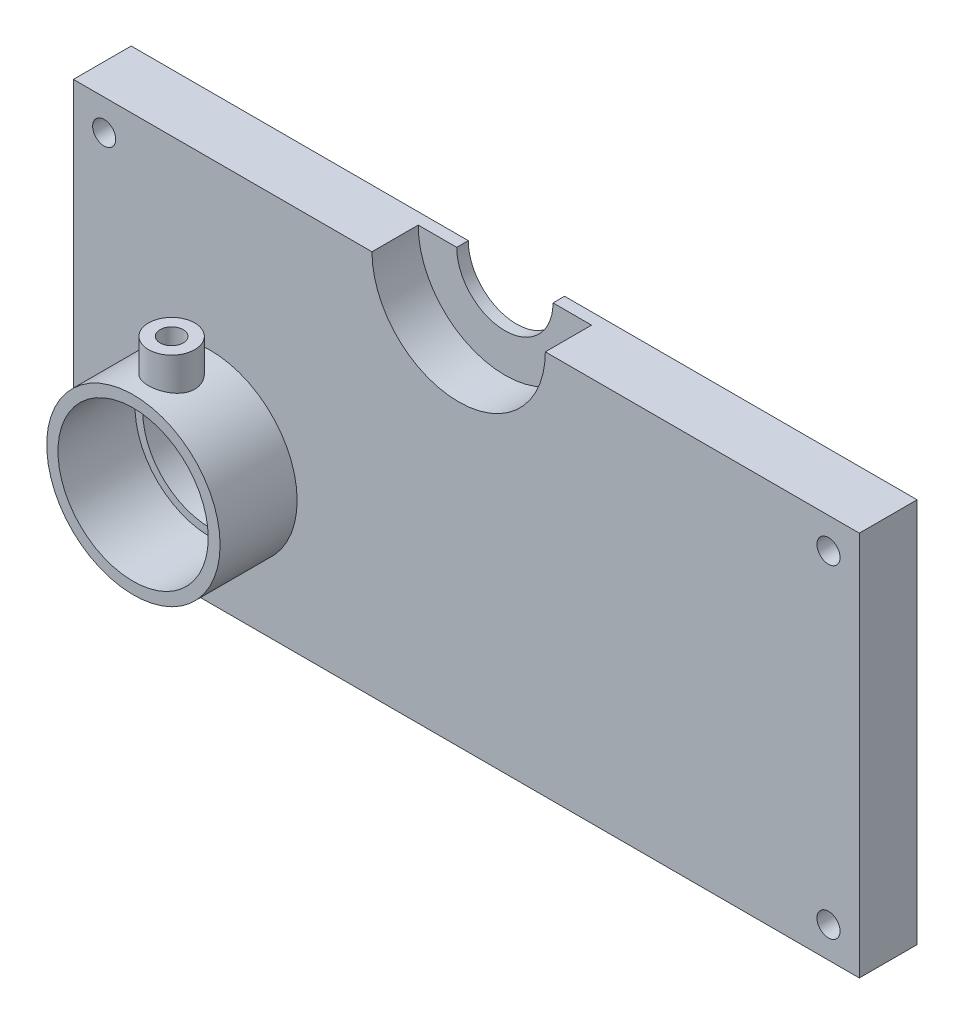
ISO-10303-21;
HEADER;
FILE_DESCRIPTION(('STEP AP214'),'2;1');
FILE_NAME('part.step','',(''),(''),'','','');
FILE_SCHEMA(('AUTOMOTIVE_DESIGN { 1 0 10303 214 1 1 1 1 }'));
ENDSEC;
DATA;
#1=APPLICATION_CONTEXT('core data for automotive mechanical design processes');
#2=APPLICATION_PROTOCOL_DEFINITION('international standard','automotive_design',2000,#1);
#3=PRODUCT_CONTEXT('',#1,'mechanical');
#4=PRODUCT('Part','Part','',(#3));
#5=PRODUCT_RELATED_PRODUCT_CATEGORY('part','',(#4));
#6=PRODUCT_DEFINITION_FORMATION('','',#4);
#7=PRODUCT_DEFINITION_CONTEXT('part definition',#1,'design');
#8=PRODUCT_DEFINITION('design','',#6,#7);
#9=PRODUCT_DEFINITION_SHAPE('','',#8);
#10=(LENGTH_UNIT() NAMED_UNIT(*) SI_UNIT(.MILLI.,.METRE.));
#11=(NAMED_UNIT(*) PLANE_ANGLE_UNIT() SI_UNIT($,.RADIAN.));
#12=(NAMED_UNIT(*) SI_UNIT($,.STERADIAN.) SOLID_ANGLE_UNIT());
#13=UNCERTAINTY_MEASURE_WITH_UNIT(LENGTH_MEASURE(1.E-05),#10,'distance_accuracy_value','');
#14=(GEOMETRIC_REPRESENTATION_CONTEXT(3) GLOBAL_UNCERTAINTY_ASSIGNED_CONTEXT((#13)) GLOBAL_UNIT_ASSIGNED_CONTEXT((#10,
#11,#12)) REPRESENTATION_CONTEXT('',''));
#15=CARTESIAN_POINT('',(0.,0.,0.));
#16=DIRECTION('',(0.,0.,1.));
#17=DIRECTION('',(1.,0.,0.));
#18=AXIS2_PLACEMENT_3D('',#15,#16,#17);
#19=CARTESIAN_POINT('',(0.,0.,105.5));
#20=DIRECTION('',(0.,0.,-1.));
#21=DIRECTION('',(-1.,0.,0.));
#22=AXIS2_PLACEMENT_3D('',#19,#20,#21);
#23=PLANE('',#22);
#24=CARTESIAN_POINT('',(-32.25,-32.79,105.5));
#25=DIRECTION('',(0.,0.,-1.));
#26=DIRECTION('',(-1.,0.,0.));
#27=AXIS2_PLACEMENT_3D('',#24,#25,#26);
#28=CIRCLE('',#27,8.75);
#29=CARTESIAN_POINT('',(-41.,-32.79,105.5));
#30=VERTEX_POINT('',#29);
#31=EDGE_CURVE('E40',#30,#30,#28,.F.);
#32=ORIENTED_EDGE('',*,*,#31,.T.);
#33=EDGE_LOOP('',(#32));
#34=FACE_BOUND('',#33,.T.);
#35=DIRECTION('',(1.,0.,0.));
#36=VECTOR('',#35,1.);
#37=CARTESIAN_POINT('',(11.25,0.,105.5));
#38=LINE('',#37,#36);
#39=CARTESIAN_POINT('',(6.25,0.,105.5));
#40=VERTEX_POINT('',#39);
#41=CARTESIAN_POINT('',(52.,0.,105.5));
#42=VERTEX_POINT('',#41);
#43=EDGE_CURVE('E52',#40,#42,#38,.T.);
#44=ORIENTED_EDGE('',*,*,#43,.T.);
#45=DIRECTION('',(0.,1.,0.));
#46=VECTOR('',#45,1.);
#47=CARTESIAN_POINT('',(52.,-50.,105.5));
#48=LINE('',#47,#46);
#49=CARTESIAN_POINT('',(52.,-50.,105.5));
#50=VERTEX_POINT('',#49);
#51=EDGE_CURVE('E106',#50,#42,#48,.T.);
#52=ORIENTED_EDGE('',*,*,#51,.F.);
#53=DIRECTION('',(-1.,0.,0.));
#54=VECTOR('',#53,1.);
#55=CARTESIAN_POINT('',(70.,-50.,105.5));
#56=LINE('',#55,#54);
#57=CARTESIAN_POINT('',(-50.,-50.,105.5));
#58=VERTEX_POINT('',#57);
#59=EDGE_CURVE('E115',#50,#58,#56,.T.);
#60=ORIENTED_EDGE('',*,*,#59,.T.);
#61=DIRECTION('',(0.,1.,0.));
#62=VECTOR('',#61,1.);
#63=CARTESIAN_POINT('',(-50.,-50.,105.5));
#64=LINE('',#63,#62);
#65=CARTESIAN_POINT('',(-50.,0.,105.5));
#66=VERTEX_POINT('',#65);
#67=EDGE_CURVE('E123',#58,#66,#64,.T.);
#68=ORIENTED_EDGE('',*,*,#67,.T.);
#69=DIRECTION('',(1.,0.,0.));
#70=VECTOR('',#69,1.);
#71=CARTESIAN_POINT('',(-50.,0.,105.5));
#72=LINE('',#71,#70);
#73=CARTESIAN_POINT('',(-6.25,0.,105.5));
#74=VERTEX_POINT('',#73);
#75=EDGE_CURVE('E128',#66,#74,#72,.T.);
#76=ORIENTED_EDGE('',*,*,#75,.T.);
#77=CARTESIAN_POINT('',(0.,0.,105.5));
#78=DIRECTION('',(0.,0.,1.));
#79=DIRECTION('',(-1.,0.,0.));
#80=AXIS2_PLACEMENT_3D('',#77,#78,#79);
#81=CIRCLE('',#80,6.25);
#82=EDGE_CURVE('E612',#74,#40,#81,.T.);
#83=ORIENTED_EDGE('',*,*,#82,.T.);
#84=EDGE_LOOP('',(#44,#52,#60,#68,#76,#83));
#85=FACE_BOUND('',#84,.T.);
#86=CARTESIAN_POINT('',(-46.,-4.,105.5));
#87=DIRECTION('',(0.,0.,-1.));
#88=DIRECTION('',(-1.,0.,0.));
#89=AXIS2_PLACEMENT_3D('',#86,#87,#88);
#90=CIRCLE('',#89,2.5);
#91=CARTESIAN_POINT('',(-48.5,-4.,105.5));
#92=VERTEX_POINT('',#91);
#93=EDGE_CURVE('E172',#92,#92,#90,.T.);
#94=ORIENTED_EDGE('',*,*,#93,.F.);
#95=EDGE_LOOP('',(#94));
#96=FACE_BOUND('',#95,.T.);
#97=CARTESIAN_POINT('',(-46.,-46.,105.5));
#98=DIRECTION('',(0.,0.,-1.));
#99=DIRECTION('',(-1.,0.,0.));
#100=AXIS2_PLACEMENT_3D('',#97,#98,#99);
#101=CIRCLE('',#100,2.5);
#102=CARTESIAN_POINT('',(-48.5,-46.,105.5));
#103=VERTEX_POINT('',#102);
#104=EDGE_CURVE('E165',#103,#103,#101,.T.);
#105=ORIENTED_EDGE('',*,*,#104,.F.);
#106=EDGE_LOOP('',(#105));
#107=FACE_BOUND('',#106,.T.);
#108=CARTESIAN_POINT('',(48.,-4.,105.5));
#109=DIRECTION('',(0.,0.,-1.));
#110=DIRECTION('',(-1.,0.,0.));
#111=AXIS2_PLACEMENT_3D('',#108,#109,#110);
#112=CIRCLE('',#111,2.5);
#113=CARTESIAN_POINT('',(45.5,-4.,105.5));
#114=VERTEX_POINT('',#113);
#115=EDGE_CURVE('E138',#114,#114,#112,.T.);
#116=ORIENTED_EDGE('',*,*,#115,.F.);
#117=EDGE_LOOP('',(#116));
#118=FACE_BOUND('',#117,.T.);
#119=CARTESIAN_POINT('',(48.,-46.,105.5));
#120=DIRECTION('',(0.,0.,-1.));
#121=DIRECTION('',(-1.,0.,0.));
#122=AXIS2_PLACEMENT_3D('',#119,#120,#121);
#123=CIRCLE('',#122,2.5);
#124=CARTESIAN_POINT('',(45.5,-46.,105.5));
#125=VERTEX_POINT('',#124);
#126=EDGE_CURVE('E154',#125,#125,#123,.T.);
#127=ORIENTED_EDGE('',*,*,#126,.F.);
#128=EDGE_LOOP('',(#127));
#129=FACE_BOUND('',#128,.T.);
#130=ADVANCED_FACE('F36',(#34,#85,#96,#107,#118,#129),#23,.T.);
#131=CARTESIAN_POINT('',(-32.2094065569838,-32.8076807104213,81.1801948466054));
#132=DIRECTION('',(0.,0.,1.));
#133=DIRECTION('',(1.,0.,0.));
#134=AXIS2_PLACEMENT_3D('',#131,#132,#133);
#135=CYLINDRICAL_SURFACE('',#134,11.25);
#136=CARTESIAN_POINT('',(-32.25,-21.5577539474426,116.5));
#137=CARTESIAN_POINT('',(-32.3338819654405,-21.5580578566096,116.500003539255));
#138=CARTESIAN_POINT('',(-32.4178119129025,-21.5593075360738,116.507059939084));
#139=CARTESIAN_POINT('',(-32.5833260562954,-21.5635907514939,116.535092742704));
#140=CARTESIAN_POINT('',(-32.6649077515966,-21.5666261202883,116.556083451572));
#141=CARTESIAN_POINT('',(-32.8233058706321,-21.5741633901945,116.611349895417));
#142=CARTESIAN_POINT('',(-32.9001256447237,-21.5786642459632,116.645616164134));
#143=CARTESIAN_POINT('',(-33.0469084090141,-21.5886562635461,116.726439306963));
#144=CARTESIAN_POINT('',(-33.1168725050613,-21.5941472652386,116.772994194383));
#145=CARTESIAN_POINT('',(-33.2484210104832,-21.6055675160041,116.877393002065));
#146=CARTESIAN_POINT('',(-33.3099550141022,-21.611499099751,116.935300188916));
#147=CARTESIAN_POINT('',(-33.4224608704641,-21.6231285925666,117.060624134275));
#148=CARTESIAN_POINT('',(-33.473432169079,-21.6288264893634,117.128041391377));
#149=CARTESIAN_POINT('',(-33.5635405693637,-21.6393820867571,117.270781099592));
#150=CARTESIAN_POINT('',(-33.6026335385311,-21.6442366260439,117.346131663513));
#151=CARTESIAN_POINT('',(-33.6675897554375,-21.652534785698,117.502407133653));
#152=CARTESIAN_POINT('',(-33.6934536126748,-21.6559784710653,117.583331782864));
#153=CARTESIAN_POINT('',(-33.7310568038163,-21.661047054635,117.747908830108));
#154=CARTESIAN_POINT('',(-33.7428854684843,-21.6626834511468,117.831540457731));
#155=CARTESIAN_POINT('',(-33.752359433518,-21.663990985714,117.999616487657));
#156=CARTESIAN_POINT('',(-33.7500054103236,-21.6636622174976,118.084060851006));
#157=CARTESIAN_POINT('',(-33.7312520959814,-21.6610860582065,118.25075850447));
#158=CARTESIAN_POINT('',(-33.7149486037589,-21.658851753867,118.333022802659));
#159=CARTESIAN_POINT('',(-33.6689088854552,-21.6527316940895,118.49363672939));
#160=CARTESIAN_POINT('',(-33.6391723461574,-21.6488459001439,118.571986266603));
#161=CARTESIAN_POINT('',(-33.5670093006978,-21.6398369358269,118.722842282313));
#162=CARTESIAN_POINT('',(-33.5245415295222,-21.634709752367,118.795328772075));
#163=CARTESIAN_POINT('',(-33.4281519824543,-21.6237858296981,118.932182309336));
#164=CARTESIAN_POINT('',(-33.3742295828053,-21.6179890540346,118.996548914366));
#165=CARTESIAN_POINT('',(-33.2559279776313,-21.6063037044292,119.11589735598));
#166=CARTESIAN_POINT('',(-33.1914654644593,-21.6004147680117,119.170796612299));
#167=CARTESIAN_POINT('',(-33.0541998417261,-21.5892334853408,119.269009248581));
#168=CARTESIAN_POINT('',(-32.9813966878729,-21.5839411422559,119.312322567014));
#169=CARTESIAN_POINT('',(-32.8294251546818,-21.5745213009363,119.386148500132));
#170=CARTESIAN_POINT('',(-32.7502520743053,-21.5703946733271,119.416651555583));
#171=CARTESIAN_POINT('',(-32.5878389812426,-21.5637539673358,119.463904533562));
#172=CARTESIAN_POINT('',(-32.5045991865417,-21.5612398026237,119.480655192396));
#173=CARTESIAN_POINT('',(-32.3370980306664,-21.5580959810788,119.499821854794));
#174=CARTESIAN_POINT('',(-32.2528493918023,-21.5574520260167,119.502346758422));
#175=CARTESIAN_POINT('',(-32.0851245822683,-21.5580546167727,119.493274640711));
#176=CARTESIAN_POINT('',(-32.0016483910273,-21.5593011120993,119.481677996542));
#177=CARTESIAN_POINT('',(-31.8381957054938,-21.5635105431954,119.444786474571));
#178=CARTESIAN_POINT('',(-31.7582060575371,-21.5664662926566,119.419548976586));
#179=CARTESIAN_POINT('',(-31.6035916198323,-21.5737373229864,119.356148318294));
#180=CARTESIAN_POINT('',(-31.5289670224644,-21.578052652577,119.317984694761));
#181=CARTESIAN_POINT('',(-31.3867513708145,-21.5875714315248,119.229573351667));
#182=CARTESIAN_POINT('',(-31.3192010137764,-21.5927796088068,119.179260687473));
#183=CARTESIAN_POINT('',(-31.1934636303101,-21.6034694742367,119.068070659523));
#184=CARTESIAN_POINT('',(-31.1352770249744,-21.6089511746706,119.0071928209));
#185=CARTESIAN_POINT('',(-31.0295329075081,-21.6195956026971,118.876125431694));
#186=CARTESIAN_POINT('',(-30.9820471454841,-21.6247560184186,118.805877775477));
#187=CARTESIAN_POINT('',(-30.8995471843203,-21.6341181817369,118.658346164468));
#188=CARTESIAN_POINT('',(-30.8645327356656,-21.6383199485128,118.581062350488));
#189=CARTESIAN_POINT('',(-30.8080701321621,-21.6452630106795,118.421846172306));
#190=CARTESIAN_POINT('',(-30.7865876417873,-21.6480079996353,118.339926152828));
#191=CARTESIAN_POINT('',(-30.7576912271218,-21.6517299056329,118.173603393842));
#192=CARTESIAN_POINT('',(-30.7502765888074,-21.6527069124098,118.089200780561));
#193=CARTESIAN_POINT('',(-30.7497406401149,-21.6527770862947,117.920985883775));
#194=CARTESIAN_POINT('',(-30.7565124109274,-21.6518843451581,117.837173926928));
#195=CARTESIAN_POINT('',(-30.7839298199057,-21.6483481029154,117.671890424576));
#196=CARTESIAN_POINT('',(-30.8045754586568,-21.6457046017353,117.59041887917));
#197=CARTESIAN_POINT('',(-30.8591198787625,-21.6389755477597,117.432147817764));
#198=CARTESIAN_POINT('',(-30.8930127558054,-21.6348906374808,117.355346237952));
#199=CARTESIAN_POINT('',(-30.9730796436689,-21.6257483077036,117.208502394012));
#200=CARTESIAN_POINT('',(-31.0192538681162,-21.6206908712891,117.138460247489));
#201=CARTESIAN_POINT('',(-31.122968754481,-21.6101416117875,117.006577163909));
#202=CARTESIAN_POINT('',(-31.1805891436805,-21.6046469137481,116.944799149833));
#203=CARTESIAN_POINT('',(-31.3053946480614,-21.593886658191,116.831748868933));
#204=CARTESIAN_POINT('',(-31.3725819793175,-21.5886211541335,116.780479042945));
#205=CARTESIAN_POINT('',(-31.5149179362986,-21.5789100835004,116.689729739646));
#206=CARTESIAN_POINT('',(-31.5900966175363,-21.5744677980555,116.650297071035));
#207=CARTESIAN_POINT('',(-31.7460277059503,-21.5669579407956,116.584672470896));
#208=CARTESIAN_POINT('',(-31.8267740299065,-21.5638888952053,116.558466340625));
#209=CARTESIAN_POINT('',(-31.9649364449169,-21.56019796525,116.526218722634));
#210=CARTESIAN_POINT('',(-32.0214878832506,-21.5591062258074,116.516400817147));
#211=CARTESIAN_POINT('',(-32.1353520796893,-21.557780356321,116.503290274541));
#212=CARTESIAN_POINT('',(-32.1926648311887,-21.5575462188409,116.499997580841));
#213=CARTESIAN_POINT('',(-32.25,-21.5577539474426,116.5));
#214=B_SPLINE_CURVE_WITH_KNOTS('',3,(#136,#137,#138,#139,#140,#141,#142,#143,#144,#145,#146,
#147,#148,#149,#150,#151,#152,#153,#154,#155,#156,#157,#158,#159,#160,#161,#162,#163,#164,#165,
#166,#167,#168,#169,#170,#171,#172,#173,#174,#175,#176,#177,#178,#179,#180,#181,#182,#183,#184,
#185,#186,#187,#188,#189,#190,#191,#192,#193,#194,#195,#196,#197,#198,#199,#200,#201,#202,#203,
#204,#205,#206,#207,#208,#209,#210,#211,#212,#213),.UNSPECIFIED.,.T.,.F.,(4,2,2,2,2,2,2,2,2,2,2,
2,2,2,2,2,2,2,2,2,2,2,2,2,2,2,2,2,2,2,2,2,2,2,2,2,2,2,4),(0.,0.251437989684872,
0.503134507697472,0.754651880524063,1.00612861557132,1.25904886007981,1.51198236962961,
1.7658444449959,2.01969482324442,2.2719206842509,2.52413451549715,2.7746300273798,
3.02513138033281,3.27645361268516,3.52778953418811,3.78121761330632,4.034647038283,
4.28826524198553,4.54186986605425,4.79353044731632,5.04518430716827,5.29578773916952,
5.5464001528429,5.79838312679742,6.05037742938802,6.3040141790307,6.55764585385341,
6.81063135220209,7.06360400974896,7.3146769478246,7.56574989649293,7.81671106898843,
8.06767660709087,8.32045572527539,8.5732934924407,8.82711829186366,9.08067002665452,
9.25253491457988,9.42439831225353),.UNSPECIFIED.);
#215=CARTESIAN_POINT('',(-32.25,-21.5577539474426,116.5));
#216=VERTEX_POINT('',#215);
#217=EDGE_CURVE('E206',#216,#216,#214,.T.);
#218=ORIENTED_EDGE('',*,*,#217,.T.);
#219=EDGE_LOOP('',(#218));
#220=FACE_BOUND('',#219,.T.);
#221=ADVANCED_FACE('F193',(#220),#135,.T.);
#222=CARTESIAN_POINT('',(-32.25,-9.01471862576142,118.));
#223=DIRECTION('',(0.,-1.,0.));
#224=DIRECTION('',(0.,0.,-1.));
#225=AXIS2_PLACEMENT_3D('',#222,#223,#224);
#226=CYLINDRICAL_SURFACE('',#225,1.5);
#227=ORIENTED_EDGE('',*,*,#217,.F.);
#228=EDGE_LOOP('',(#227));
#229=FACE_BOUND('',#228,.T.);
#230=CARTESIAN_POINT('',(-32.25,-17.5,118.));
#231=DIRECTION('',(0.,1.,0.));
#232=DIRECTION('',(0.,0.,1.));
#233=AXIS2_PLACEMENT_3D('',#230,#231,#232);
#234=CIRCLE('',#233,1.5);
#235=CARTESIAN_POINT('',(-32.25,-17.5,119.5));
#236=VERTEX_POINT('',#235);
#237=EDGE_CURVE('E175',#236,#236,#234,.T.);
#238=ORIENTED_EDGE('',*,*,#237,.T.);
#239=EDGE_LOOP('',(#238));
#240=FACE_BOUND('',#239,.T.);
#241=ADVANCED_FACE('F198',(#229,#240),#226,.F.);
#242=CARTESIAN_POINT('',(32.86,-17.5,118.));
#243=DIRECTION('',(0.,1.,0.));
#244=DIRECTION('',(0.,0.,1.));
#245=AXIS2_PLACEMENT_3D('',#242,#243,#244);
#246=PLANE('',#245);
#247=ORIENTED_EDGE('',*,*,#237,.F.);
#248=EDGE_LOOP('',(#247));
#249=FACE_BOUND('',#248,.T.);
#250=CARTESIAN_POINT('',(-32.25,-17.5,118.));
#251=DIRECTION('',(0.,1.,0.));
#252=DIRECTION('',(0.,0.,1.));
#253=AXIS2_PLACEMENT_3D('',#250,#251,#252);
#254=CIRCLE('',#253,3.);
#255=CARTESIAN_POINT('',(-32.25,-17.5,121.));
#256=VERTEX_POINT('',#255);
#257=EDGE_CURVE('E171',#256,#256,#254,.T.);
#258=ORIENTED_EDGE('',*,*,#257,.T.);
#259=EDGE_LOOP('',(#258));
#260=FACE_BOUND('',#259,.T.);
#261=ADVANCED_FACE('F201',(#249,#260),#246,.T.);
#262=CARTESIAN_POINT('',(-32.25,-9.01471862576142,118.));
#263=DIRECTION('',(0.,-1.,0.));
#264=DIRECTION('',(0.,0.,-1.));
#265=AXIS2_PLACEMENT_3D('',#262,#263,#264);
#266=CYLINDRICAL_SURFACE('',#265,3.);
#267=CARTESIAN_POINT('',(-32.25,-21.5577539474426,115.));
#268=CARTESIAN_POINT('',(-32.4154768633816,-21.5583535784474,115.000003980944));
#269=CARTESIAN_POINT('',(-32.5809831135079,-21.562635315604,115.013737289353));
#270=CARTESIAN_POINT('',(-32.907200531887,-21.5781527674895,115.068197730675));
#271=CARTESIAN_POINT('',(-33.0679093035032,-21.5893918988847,115.108938127038));
#272=CARTESIAN_POINT('',(-33.3797771734199,-21.6176301618664,115.215983245237));
#273=CARTESIAN_POINT('',(-33.5309485353168,-21.6346217099711,115.282254325443));
#274=CARTESIAN_POINT('',(-33.8200213604739,-21.672614361303,115.438354549169));
#275=CARTESIAN_POINT('',(-33.9579219463401,-21.693615729365,115.528185248866));
#276=CARTESIAN_POINT('',(-34.219794117849,-21.7379530204198,115.73109575534));
#277=CARTESIAN_POINT('',(-34.3434079368268,-21.7613290331632,115.844628554976));
#278=CARTESIAN_POINT('',(-34.570080432813,-21.8075384632834,116.090753331067));
#279=CARTESIAN_POINT('',(-34.6731364568754,-21.8303718102957,116.223347763597));
#280=CARTESIAN_POINT('',(-34.8574476177956,-21.8733534061958,116.506601536664));
#281=CARTESIAN_POINT('',(-34.9383052081923,-21.8934497995654,116.657528130639));
#282=CARTESIAN_POINT('',(-35.0733503464633,-21.9281025584128,116.971469327741));
#283=CARTESIAN_POINT('',(-35.1275430185222,-21.9426599881886,117.134481601433));
#284=CARTESIAN_POINT('',(-35.2064528498197,-21.9641636388092,117.463909129933));
#285=CARTESIAN_POINT('',(-35.2318338569451,-21.9712809670022,117.630153938362));
#286=CARTESIAN_POINT('',(-35.2544707229852,-21.9776191067286,117.964682538408));
#287=CARTESIAN_POINT('',(-35.2517319563705,-21.9768414272178,118.132965934254));
#288=CARTESIAN_POINT('',(-35.2187270291179,-21.9676274483977,118.461711873831));
#289=CARTESIAN_POINT('',(-35.1892482842081,-21.9594102351893,118.622260581307));
#290=CARTESIAN_POINT('',(-35.1048597015684,-21.9365840166103,118.936043833827));
#291=CARTESIAN_POINT('',(-35.0499478006892,-21.9219744926978,119.089277784382));
#292=CARTESIAN_POINT('',(-34.9156081869283,-21.8877994897766,119.386141652402));
#293=CARTESIAN_POINT('',(-34.8359036842668,-21.8681785282093,119.529639659802));
#294=CARTESIAN_POINT('',(-34.6544388207268,-21.8261977497566,119.801498537176));
#295=CARTESIAN_POINT('',(-34.552674032163,-21.803837383442,119.92985636039));
#296=CARTESIAN_POINT('',(-34.3259377482359,-21.7579481721029,120.172312389678));
#297=CARTESIAN_POINT('',(-34.2003024833645,-21.7344052880612,120.285788081026));
#298=CARTESIAN_POINT('',(-33.9315079372061,-21.6894340803747,120.490188580253));
#299=CARTESIAN_POINT('',(-33.7883478695966,-21.6680058516905,120.581112375694));
#300=CARTESIAN_POINT('',(-33.4875121085775,-21.6294864170923,120.738154681095));
#301=CARTESIAN_POINT('',(-33.3297669222011,-21.6124176038825,120.804145920442));
#302=CARTESIAN_POINT('',(-33.0048574880141,-21.5846551423132,120.908485109137));
#303=CARTESIAN_POINT('',(-32.8376953139492,-21.5739600963256,120.946839119113));
#304=CARTESIAN_POINT('',(-32.503895145717,-21.5603313783665,120.993846858852));
#305=CARTESIAN_POINT('',(-32.337382598554,-21.5571815706079,121.003329835222));
#306=CARTESIAN_POINT('',(-32.0051222795278,-21.5583092493875,120.994602749251));
#307=CARTESIAN_POINT('',(-31.8393744269798,-21.5625859334934,120.976395678845));
#308=CARTESIAN_POINT('',(-31.5164315416854,-21.577900105709,120.913496386527));
#309=CARTESIAN_POINT('',(-31.3591364003418,-21.5888148863772,120.869285333674));
#310=CARTESIAN_POINT('',(-31.0541992933475,-21.6161011947315,120.756177498346));
#311=CARTESIAN_POINT('',(-30.9065583393468,-21.6324732931902,120.687278133701));
#312=CARTESIAN_POINT('',(-30.6220309045898,-21.6692910632521,120.525276668506));
#313=CARTESIAN_POINT('',(-30.4853998997416,-21.6898077665677,120.431742438853));
#314=CARTESIAN_POINT('',(-30.229478820641,-21.7325171332581,120.223669132916));
#315=CARTESIAN_POINT('',(-30.1101921369895,-21.7547101230413,120.109125959514));
#316=CARTESIAN_POINT('',(-29.8888886932469,-21.7990108858182,119.858461177149));
#317=CARTESIAN_POINT('',(-29.787450901624,-21.821098768549,119.721823978457));
#318=CARTESIAN_POINT('',(-29.6089239968263,-21.8619779016708,119.43301529213));
#319=CARTESIAN_POINT('',(-29.5318339700235,-21.8807692757484,119.280844387667));
#320=CARTESIAN_POINT('',(-29.4047173741663,-21.9127039200495,118.965939962586));
#321=CARTESIAN_POINT('',(-29.3545517613135,-21.9258761349985,118.803265666532));
#322=CARTESIAN_POINT('',(-29.2824060621586,-21.9450572780414,118.471385832459));
#323=CARTESIAN_POINT('',(-29.2604189768093,-21.9510679849009,118.302181927038));
#324=CARTESIAN_POINT('',(-29.2456575019529,-21.9550892588466,117.967836137096));
#325=CARTESIAN_POINT('',(-29.2519737800098,-21.9533488650073,117.802736814535));
#326=CARTESIAN_POINT('',(-29.2915300850424,-21.9426492771837,117.476046301032));
#327=CARTESIAN_POINT('',(-29.3247694405956,-21.9336902632214,117.314455022706));
#328=CARTESIAN_POINT('',(-29.4166991652385,-21.9097222357156,117.000517506315));
#329=CARTESIAN_POINT('',(-29.4751956911687,-21.8947593610886,116.848110733515));
#330=CARTESIAN_POINT('',(-29.6158307694377,-21.8604856512545,116.555159543688));
#331=CARTESIAN_POINT('',(-29.6979729723079,-21.8411741447854,116.414616962646));
#332=CARTESIAN_POINT('',(-29.8863421296402,-21.7997103779783,116.14502497273));
#333=CARTESIAN_POINT('',(-29.9931930360042,-21.7774924607874,116.016421564473));
#334=CARTESIAN_POINT('',(-30.2267635766931,-21.7331272952101,115.778673132738));
#335=CARTESIAN_POINT('',(-30.3534879313242,-21.7109800648917,115.669532745278));
#336=CARTESIAN_POINT('',(-30.6263434981406,-21.6687475269431,115.47161710575));
#337=CARTESIAN_POINT('',(-30.7728187806726,-21.6487136886779,115.383304306647));
#338=CARTESIAN_POINT('',(-31.0790661656027,-21.6135521994348,115.232692841742));
#339=CARTESIAN_POINT('',(-31.2388295776273,-21.5984213731262,115.170377331806));
#340=CARTESIAN_POINT('',(-31.5400231003169,-21.5767696978462,115.08171575655));
#341=CARTESIAN_POINT('',(-31.6801508086031,-21.5692424835571,115.051141256548));
#342=CARTESIAN_POINT('',(-31.9635118674539,-21.5594753060095,115.010282618788));
#343=CARTESIAN_POINT('',(-32.1067449217073,-21.5572348405126,114.999996553655));
#344=CARTESIAN_POINT('',(-32.25,-21.5577539474426,115.));
#345=B_SPLINE_CURVE_WITH_KNOTS('',3,(#267,#268,#269,#270,#271,#272,#273,#274,#275,#276,#277,
#278,#279,#280,#281,#282,#283,#284,#285,#286,#287,#288,#289,#290,#291,#292,#293,#294,#295,#296,
#297,#298,#299,#300,#301,#302,#303,#304,#305,#306,#307,#308,#309,#310,#311,#312,#313,#314,#315,
#316,#317,#318,#319,#320,#321,#322,#323,#324,#325,#326,#327,#328,#329,#330,#331,#332,#333,#334,
#335,#336,#337,#338,#339,#340,#341,#342,#343,#344),.UNSPECIFIED.,.T.,.F.,(4,2,2,2,2,2,2,2,2,2,2,
2,2,2,2,2,2,2,2,2,2,2,2,2,2,2,2,2,2,2,2,2,2,2,2,2,2,2,4),(0.,0.495907899653028,
0.992059525245708,1.48755959872095,1.9830924095837,2.48914288769853,2.99525862851809,
3.50992127223932,4.02448497482082,4.5269353855854,5.02928976589134,5.51731506189958,
6.00537995367991,6.49910209984125,6.99292343209672,7.50330436615868,8.01370820896531,
8.52668334347717,9.03954595231354,9.53753192045913,10.0354640845785,10.5244603070572,
11.0135076889803,11.5117824204145,12.0101544278338,12.5225201616341,13.0348666670868,
13.5445411992005,14.0540891126352,14.5473857142175,15.0406700140793,15.5302339466032,
16.0198735008982,16.5235752978807,17.0273969149243,17.5415286469397,18.0553267439922,
18.4846802701663,18.9139930063337),.UNSPECIFIED.);
#346=CARTESIAN_POINT('',(-32.25,-21.5577539474426,115.));
#347=VERTEX_POINT('',#346);
#348=EDGE_CURVE('E178',#347,#347,#345,.T.);
#349=ORIENTED_EDGE('',*,*,#348,.T.);
#350=EDGE_LOOP('',(#349));
#351=FACE_BOUND('',#350,.T.);
#352=ORIENTED_EDGE('',*,*,#257,.F.);
#353=EDGE_LOOP('',(#352));
#354=FACE_BOUND('',#353,.T.);
#355=ADVANCED_FACE('F189',(#351,#354),#266,.T.);
#356=CARTESIAN_POINT('',(32.86,-32.68,123.));
#357=DIRECTION('',(0.,0.,1.));
#358=DIRECTION('',(1.,0.,0.));
#359=AXIS2_PLACEMENT_3D('',#356,#357,#358);
#360=PLANE('',#359);
#361=CARTESIAN_POINT('',(-32.25,-32.79,123.));
#362=DIRECTION('',(0.,0.,1.));
#363=DIRECTION('',(1.,0.,0.));
#364=AXIS2_PLACEMENT_3D('',#361,#362,#363);
#365=CIRCLE('',#364,9.75);
#366=CARTESIAN_POINT('',(-22.5,-32.79,123.));
#367=VERTEX_POINT('',#366);
#368=EDGE_CURVE('E45',#367,#367,#365,.T.);
#369=ORIENTED_EDGE('',*,*,#368,.F.);
#370=EDGE_LOOP('',(#369));
#371=FACE_BOUND('',#370,.T.);
#372=CARTESIAN_POINT('',(-32.2094065569838,-32.8076807104213,123.));
#373=DIRECTION('',(0.,0.,1.));
#374=DIRECTION('',(1.,0.,0.));
#375=AXIS2_PLACEMENT_3D('',#372,#373,#374);
#376=CIRCLE('',#375,11.25);
#377=CARTESIAN_POINT('',(-20.9594065569838,-32.8076807104213,123.));
#378=VERTEX_POINT('',#377);
#379=EDGE_CURVE('E187',#378,#378,#376,.T.);
#380=ORIENTED_EDGE('',*,*,#379,.T.);
#381=EDGE_LOOP('',(#380));
#382=FACE_BOUND('',#381,.T.);
#383=ADVANCED_FACE('F229',(#371,#382),#360,.T.);
#384=CARTESIAN_POINT('',(-32.25,-32.79,81.1801948466054));
#385=DIRECTION('',(0.,0.,1.));
#386=DIRECTION('',(1.,0.,0.));
#387=AXIS2_PLACEMENT_3D('',#384,#385,#386);
#388=CYLINDRICAL_SURFACE('',#387,9.75);
#389=CARTESIAN_POINT('',(-32.25,-32.79,113.));
#390=DIRECTION('',(0.,0.,1.));
#391=DIRECTION('',(1.,0.,0.));
#392=AXIS2_PLACEMENT_3D('',#389,#390,#391);
#393=CIRCLE('',#392,9.75);
#394=CARTESIAN_POINT('',(-22.5,-32.79,113.));
#395=VERTEX_POINT('',#394);
#396=EDGE_CURVE('E277',#395,#395,#393,.F.);
#397=ORIENTED_EDGE('',*,*,#396,.T.);
#398=EDGE_LOOP('',(#397));
#399=FACE_BOUND('',#398,.T.);
#400=ORIENTED_EDGE('',*,*,#368,.T.);
#401=EDGE_LOOP('',(#400));
#402=FACE_BOUND('',#401,.T.);
#403=ADVANCED_FACE('F202',(#399,#402),#388,.F.);
#404=CARTESIAN_POINT('',(0.,0.,113.));
#405=DIRECTION('',(0.,0.,1.));
#406=DIRECTION('',(1.,0.,0.));
#407=AXIS2_PLACEMENT_3D('',#404,#405,#406);
#408=PLANE('',#407);
#409=CARTESIAN_POINT('',(-32.25,-32.79,113.));
#410=DIRECTION('',(0.,0.,1.));
#411=DIRECTION('',(1.,0.,0.));
#412=AXIS2_PLACEMENT_3D('',#409,#410,#411);
#413=CIRCLE('',#412,8.75);
#414=CARTESIAN_POINT('',(-23.5,-32.79,113.));
#415=VERTEX_POINT('',#414);
#416=EDGE_CURVE('E11',#415,#415,#413,.F.);
#417=ORIENTED_EDGE('',*,*,#416,.T.);
#418=EDGE_LOOP('',(#417));
#419=FACE_BOUND('',#418,.T.);
#420=ORIENTED_EDGE('',*,*,#396,.F.);
#421=EDGE_LOOP('',(#420));
#422=FACE_BOUND('',#421,.T.);
#423=ADVANCED_FACE('F263',(#419,#422),#408,.T.);
#424=CARTESIAN_POINT('',(-32.25,-32.79,137.748737341529));
#425=DIRECTION('',(0.,0.,-1.));
#426=DIRECTION('',(-1.,0.,0.));
#427=AXIS2_PLACEMENT_3D('',#424,#425,#426);
#428=CYLINDRICAL_SURFACE('',#427,8.75);
#429=ORIENTED_EDGE('',*,*,#416,.F.);
#430=EDGE_LOOP('',(#429));
#431=FACE_BOUND('',#430,.T.);
#432=ORIENTED_EDGE('',*,*,#31,.F.);
#433=EDGE_LOOP('',(#432));
#434=FACE_BOUND('',#433,.T.);
#435=ADVANCED_FACE('F38',(#431,#434),#428,.F.);
#436=CARTESIAN_POINT('',(48.,-46.,115.5));
#437=DIRECTION('',(0.,0.,-1.));
#438=DIRECTION('',(-1.,0.,0.));
#439=AXIS2_PLACEMENT_3D('',#436,#437,#438);
#440=CYLINDRICAL_SURFACE('',#439,1.5);
#441=CARTESIAN_POINT('',(48.,-46.,113.));
#442=DIRECTION('',(0.,0.,1.));
#443=DIRECTION('',(1.,0.,0.));
#444=AXIS2_PLACEMENT_3D('',#441,#442,#443);
#445=CIRCLE('',#444,1.5);
#446=CARTESIAN_POINT('',(49.5,-46.,113.));
#447=VERTEX_POINT('',#446);
#448=EDGE_CURVE('E147',#447,#447,#445,.T.);
#449=ORIENTED_EDGE('',*,*,#448,.T.);
#450=EDGE_LOOP('',(#449));
#451=FACE_BOUND('',#450,.T.);
#452=CARTESIAN_POINT('',(48.,-46.,107.5));
#453=DIRECTION('',(0.,0.,-1.));
#454=DIRECTION('',(-1.,0.,0.));
#455=AXIS2_PLACEMENT_3D('',#452,#453,#454);
#456=CIRCLE('',#455,1.5);
#457=CARTESIAN_POINT('',(46.5,-46.,107.5));
#458=VERTEX_POINT('',#457);
#459=EDGE_CURVE('E153',#458,#458,#456,.F.);
#460=ORIENTED_EDGE('',*,*,#459,.F.);
#461=EDGE_LOOP('',(#460));
#462=FACE_BOUND('',#461,.T.);
#463=ADVANCED_FACE('F262',(#451,#462),#440,.F.);
#464=CARTESIAN_POINT('',(48.,-46.,107.5));
#465=DIRECTION('',(0.,0.,-1.));
#466=DIRECTION('',(-1.,0.,0.));
#467=AXIS2_PLACEMENT_3D('',#464,#465,#466);
#468=PLANE('',#467);
#469=CARTESIAN_POINT('',(48.,-46.,107.5));
#470=DIRECTION('',(0.,0.,-1.));
#471=DIRECTION('',(-1.,0.,0.));
#472=AXIS2_PLACEMENT_3D('',#469,#470,#471);
#473=CIRCLE('',#472,2.5);
#474=CARTESIAN_POINT('',(45.5,-46.,107.5));
#475=VERTEX_POINT('',#474);
#476=EDGE_CURVE('E158',#475,#475,#473,.T.);
#477=ORIENTED_EDGE('',*,*,#476,.T.);
#478=EDGE_LOOP('',(#477));
#479=FACE_BOUND('',#478,.T.);
#480=ORIENTED_EDGE('',*,*,#459,.T.);
#481=EDGE_LOOP('',(#480));
#482=FACE_BOUND('',#481,.T.);
#483=ADVANCED_FACE('F269',(#479,#482),#468,.T.);
#484=CARTESIAN_POINT('',(48.,-46.,107.5));
#485=DIRECTION('',(0.,0.,-1.));
#486=DIRECTION('',(-1.,0.,0.));
#487=AXIS2_PLACEMENT_3D('',#484,#485,#486);
#488=CYLINDRICAL_SURFACE('',#487,2.5);
#489=ORIENTED_EDGE('',*,*,#476,.F.);
#490=EDGE_LOOP('',(#489));
#491=FACE_BOUND('',#490,.T.);
#492=ORIENTED_EDGE('',*,*,#126,.T.);
#493=EDGE_LOOP('',(#492));
#494=FACE_BOUND('',#493,.T.);
#495=ADVANCED_FACE('F315',(#491,#494),#488,.F.);
#496=CARTESIAN_POINT('',(48.,-4.,117.242640687119));
#497=DIRECTION('',(0.,0.,-1.));
#498=DIRECTION('',(-1.,0.,0.));
#499=AXIS2_PLACEMENT_3D('',#496,#497,#498);
#500=CYLINDRICAL_SURFACE('',#499,1.5);
#501=CARTESIAN_POINT('',(48.,-4.,113.));
#502=DIRECTION('',(0.,0.,1.));
#503=DIRECTION('',(1.,0.,0.));
#504=AXIS2_PLACEMENT_3D('',#501,#502,#503);
#505=CIRCLE('',#504,1.5);
#506=CARTESIAN_POINT('',(49.5,-4.,113.));
#507=VERTEX_POINT('',#506);
#508=EDGE_CURVE('E117',#507,#507,#505,.F.);
#509=ORIENTED_EDGE('',*,*,#508,.F.);
#510=EDGE_LOOP('',(#509));
#511=FACE_BOUND('',#510,.T.);
#512=CARTESIAN_POINT('',(48.,-4.,107.5));
#513=DIRECTION('',(0.,0.,-1.));
#514=DIRECTION('',(-1.,0.,0.));
#515=AXIS2_PLACEMENT_3D('',#512,#513,#514);
#516=CIRCLE('',#515,1.5);
#517=CARTESIAN_POINT('',(46.5,-4.,107.5));
#518=VERTEX_POINT('',#517);
#519=EDGE_CURVE('E137',#518,#518,#516,.F.);
#520=ORIENTED_EDGE('',*,*,#519,.F.);
#521=EDGE_LOOP('',(#520));
#522=FACE_BOUND('',#521,.T.);
#523=ADVANCED_FACE('F325',(#511,#522),#500,.F.);
#524=CARTESIAN_POINT('',(48.,-4.,107.5));
#525=DIRECTION('',(0.,0.,-1.));
#526=DIRECTION('',(-1.,0.,0.));
#527=AXIS2_PLACEMENT_3D('',#524,#525,#526);
#528=PLANE('',#527);
#529=CARTESIAN_POINT('',(48.,-4.,107.5));
#530=DIRECTION('',(0.,0.,-1.));
#531=DIRECTION('',(-1.,0.,0.));
#532=AXIS2_PLACEMENT_3D('',#529,#530,#531);
#533=CIRCLE('',#532,2.5);
#534=CARTESIAN_POINT('',(45.5,-4.,107.5));
#535=VERTEX_POINT('',#534);
#536=EDGE_CURVE('E142',#535,#535,#533,.T.);
#537=ORIENTED_EDGE('',*,*,#536,.T.);
#538=EDGE_LOOP('',(#537));
#539=FACE_BOUND('',#538,.T.);
#540=ORIENTED_EDGE('',*,*,#519,.T.);
#541=EDGE_LOOP('',(#540));
#542=FACE_BOUND('',#541,.T.);
#543=ADVANCED_FACE('F335',(#539,#542),#528,.T.);
#544=CARTESIAN_POINT('',(48.,-4.,107.5));
#545=DIRECTION('',(0.,0.,-1.));
#546=DIRECTION('',(-1.,0.,0.));
#547=AXIS2_PLACEMENT_3D('',#544,#545,#546);
#548=CYLINDRICAL_SURFACE('',#547,2.5);
#549=ORIENTED_EDGE('',*,*,#536,.F.);
#550=EDGE_LOOP('',(#549));
#551=FACE_BOUND('',#550,.T.);
#552=ORIENTED_EDGE('',*,*,#115,.T.);
#553=EDGE_LOOP('',(#552));
#554=FACE_BOUND('',#553,.T.);
#555=ADVANCED_FACE('F345',(#551,#554),#548,.F.);
#556=CARTESIAN_POINT('',(-46.,-46.,115.5));
#557=DIRECTION('',(0.,0.,-1.));
#558=DIRECTION('',(-1.,0.,0.));
#559=AXIS2_PLACEMENT_3D('',#556,#557,#558);
#560=CYLINDRICAL_SURFACE('',#559,1.5);
#561=CARTESIAN_POINT('',(-46.,-46.,113.));
#562=DIRECTION('',(0.,0.,1.));
#563=DIRECTION('',(1.,0.,0.));
#564=AXIS2_PLACEMENT_3D('',#561,#562,#563);
#565=CIRCLE('',#564,1.5);
#566=CARTESIAN_POINT('',(-44.5,-46.,113.));
#567=VERTEX_POINT('',#566);
#568=EDGE_CURVE('E141',#567,#567,#565,.T.);
#569=ORIENTED_EDGE('',*,*,#568,.T.);
#570=EDGE_LOOP('',(#569));
#571=FACE_BOUND('',#570,.T.);
#572=CARTESIAN_POINT('',(-46.,-46.,107.5));
#573=DIRECTION('',(0.,0.,-1.));
#574=DIRECTION('',(-1.,0.,0.));
#575=AXIS2_PLACEMENT_3D('',#572,#573,#574);
#576=CIRCLE('',#575,1.5);
#577=CARTESIAN_POINT('',(-47.5,-46.,107.5));
#578=VERTEX_POINT('',#577);
#579=EDGE_CURVE('E157',#578,#578,#576,.F.);
#580=ORIENTED_EDGE('',*,*,#579,.F.);
#581=EDGE_LOOP('',(#580));
#582=FACE_BOUND('',#581,.T.);
#583=ADVANCED_FACE('F355',(#571,#582),#560,.F.);
#584=CARTESIAN_POINT('',(-46.,-46.,107.5));
#585=DIRECTION('',(0.,0.,-1.));
#586=DIRECTION('',(-1.,0.,0.));
#587=AXIS2_PLACEMENT_3D('',#584,#585,#586);
#588=PLANE('',#587);
#589=CARTESIAN_POINT('',(-46.,-46.,107.5));
#590=DIRECTION('',(0.,0.,-1.));
#591=DIRECTION('',(-1.,0.,0.));
#592=AXIS2_PLACEMENT_3D('',#589,#590,#591);
#593=CIRCLE('',#592,2.5);
#594=CARTESIAN_POINT('',(-48.5,-46.,107.5));
#595=VERTEX_POINT('',#594);
#596=EDGE_CURVE('E161',#595,#595,#593,.T.);
#597=ORIENTED_EDGE('',*,*,#596,.T.);
#598=EDGE_LOOP('',(#597));
#599=FACE_BOUND('',#598,.T.);
#600=ORIENTED_EDGE('',*,*,#579,.T.);
#601=EDGE_LOOP('',(#600));
#602=FACE_BOUND('',#601,.T.);
#603=ADVANCED_FACE('F365',(#599,#602),#588,.T.);
#604=CARTESIAN_POINT('',(-46.,-46.,107.5));
#605=DIRECTION('',(0.,0.,-1.));
#606=DIRECTION('',(-1.,0.,0.));
#607=AXIS2_PLACEMENT_3D('',#604,#605,#606);
#608=CYLINDRICAL_SURFACE('',#607,2.5);
#609=ORIENTED_EDGE('',*,*,#596,.F.);
#610=EDGE_LOOP('',(#609));
#611=FACE_BOUND('',#610,.T.);
#612=ORIENTED_EDGE('',*,*,#104,.T.);
#613=EDGE_LOOP('',(#612));
#614=FACE_BOUND('',#613,.T.);
#615=ADVANCED_FACE('F375',(#611,#614),#608,.F.);
#616=CARTESIAN_POINT('',(-46.,-4.,115.5));
#617=DIRECTION('',(0.,0.,-1.));
#618=DIRECTION('',(-1.,0.,0.));
#619=AXIS2_PLACEMENT_3D('',#616,#617,#618);
#620=CYLINDRICAL_SURFACE('',#619,1.5);
#621=CARTESIAN_POINT('',(-46.,-4.,113.));
#622=DIRECTION('',(0.,0.,1.));
#623=DIRECTION('',(1.,0.,0.));
#624=AXIS2_PLACEMENT_3D('',#621,#622,#623);
#625=CIRCLE('',#624,1.5);
#626=CARTESIAN_POINT('',(-44.5,-4.,113.));
#627=VERTEX_POINT('',#626);
#628=EDGE_CURVE('E150',#627,#627,#625,.T.);
#629=ORIENTED_EDGE('',*,*,#628,.T.);
#630=EDGE_LOOP('',(#629));
#631=FACE_BOUND('',#630,.T.);
#632=CARTESIAN_POINT('',(-46.,-4.,107.5));
#633=DIRECTION('',(0.,0.,-1.));
#634=DIRECTION('',(-1.,0.,0.));
#635=AXIS2_PLACEMENT_3D('',#632,#633,#634);
#636=CIRCLE('',#635,1.5);
#637=CARTESIAN_POINT('',(-47.5,-4.,107.5));
#638=VERTEX_POINT('',#637);
#639=EDGE_CURVE('E164',#638,#638,#636,.F.);
#640=ORIENTED_EDGE('',*,*,#639,.F.);
#641=EDGE_LOOP('',(#640));
#642=FACE_BOUND('',#641,.T.);
#643=ADVANCED_FACE('F385',(#631,#642),#620,.F.);
#644=CARTESIAN_POINT('',(-46.,-4.,107.5));
#645=DIRECTION('',(0.,0.,-1.));
#646=DIRECTION('',(-1.,0.,0.));
#647=AXIS2_PLACEMENT_3D('',#644,#645,#646);
#648=PLANE('',#647);
#649=CARTESIAN_POINT('',(-46.,-4.,107.5));
#650=DIRECTION('',(0.,0.,-1.));
#651=DIRECTION('',(-1.,0.,0.));
#652=AXIS2_PLACEMENT_3D('',#649,#650,#651);
#653=CIRCLE('',#652,2.5);
#654=CARTESIAN_POINT('',(-48.5,-4.,107.5));
#655=VERTEX_POINT('',#654);
#656=EDGE_CURVE('E168',#655,#655,#653,.T.);
#657=ORIENTED_EDGE('',*,*,#656,.T.);
#658=EDGE_LOOP('',(#657));
#659=FACE_BOUND('',#658,.T.);
#660=ORIENTED_EDGE('',*,*,#639,.T.);
#661=EDGE_LOOP('',(#660));
#662=FACE_BOUND('',#661,.T.);
#663=ADVANCED_FACE('F248',(#659,#662),#648,.T.);
#664=CARTESIAN_POINT('',(-46.,-4.,107.5));
#665=DIRECTION('',(0.,0.,-1.));
#666=DIRECTION('',(-1.,0.,0.));
#667=AXIS2_PLACEMENT_3D('',#664,#665,#666);
#668=CYLINDRICAL_SURFACE('',#667,2.5);
#669=ORIENTED_EDGE('',*,*,#656,.F.);
#670=EDGE_LOOP('',(#669));
#671=FACE_BOUND('',#670,.T.);
#672=ORIENTED_EDGE('',*,*,#93,.T.);
#673=EDGE_LOOP('',(#672));
#674=FACE_BOUND('',#673,.T.);
#675=ADVANCED_FACE('F239',(#671,#674),#668,.F.);
#676=ORIENTED_EDGE('',*,*,#379,.F.);
#677=EDGE_LOOP('',(#676));
#678=FACE_BOUND('',#677,.T.);
#679=CARTESIAN_POINT('',(-32.2094065569838,-32.8076807104213,113.));
#680=DIRECTION('',(0.,0.,1.));
#681=DIRECTION('',(1.,0.,0.));
#682=AXIS2_PLACEMENT_3D('',#679,#680,#681);
#683=CIRCLE('',#682,11.25);
#684=CARTESIAN_POINT('',(-20.9594065569838,-32.8076807104213,113.));
#685=VERTEX_POINT('',#684);
#686=EDGE_CURVE('E213',#685,#685,#683,.T.);
#687=ORIENTED_EDGE('',*,*,#686,.T.);
#688=EDGE_LOOP('',(#687));
#689=FACE_BOUND('',#688,.T.);
#690=ORIENTED_EDGE('',*,*,#348,.F.);
#691=EDGE_LOOP('',(#690));
#692=FACE_BOUND('',#691,.T.);
#693=ADVANCED_FACE('F200',(#678,#689,#692),#135,.T.);
#694=CARTESIAN_POINT('',(-50.,0.,110.));
#695=DIRECTION('',(1.,0.,0.));
#696=DIRECTION('',(0.,1.,0.));
#697=AXIS2_PLACEMENT_3D('',#694,#695,#696);
#698=PLANE('',#697);
#699=DIRECTION('',(0.,0.,-1.));
#700=VECTOR('',#699,1.);
#701=CARTESIAN_POINT('',(-50.,0.,110.));
#702=LINE('',#701,#700);
#703=CARTESIAN_POINT('',(-50.,0.,113.));
#704=VERTEX_POINT('',#703);
#705=EDGE_CURVE('E637',#704,#66,#702,.T.);
#706=ORIENTED_EDGE('',*,*,#705,.T.);
#707=ORIENTED_EDGE('',*,*,#67,.F.);
#708=DIRECTION('',(0.,0.,-1.));
#709=VECTOR('',#708,1.);
#710=CARTESIAN_POINT('',(-50.,-50.,110.));
#711=LINE('',#710,#709);
#712=CARTESIAN_POINT('',(-50.,-50.,113.));
#713=VERTEX_POINT('',#712);
#714=EDGE_CURVE('E120',#713,#58,#711,.T.);
#715=ORIENTED_EDGE('',*,*,#714,.F.);
#716=DIRECTION('',(0.,-1.,0.));
#717=VECTOR('',#716,1.);
#718=CARTESIAN_POINT('',(-50.,0.,113.));
#719=LINE('',#718,#717);
#720=EDGE_CURVE('E630',#704,#713,#719,.T.);
#721=ORIENTED_EDGE('',*,*,#720,.F.);
#722=EDGE_LOOP('',(#706,#707,#715,#721));
#723=FACE_BOUND('',#722,.T.);
#724=ADVANCED_FACE('F238',(#723),#698,.F.);
#725=CARTESIAN_POINT('',(0.,0.,110.));
#726=DIRECTION('',(0.,0.,-1.));
#727=DIRECTION('',(-1.,0.,0.));
#728=AXIS2_PLACEMENT_3D('',#725,#726,#727);
#729=CYLINDRICAL_SURFACE('',#728,11.25);
#730=CARTESIAN_POINT('',(0.,0.,107.));
#731=DIRECTION('',(0.,0.,1.));
#732=DIRECTION('',(1.,0.,0.));
#733=AXIS2_PLACEMENT_3D('',#730,#731,#732);
#734=CIRCLE('',#733,11.25);
#735=CARTESIAN_POINT('',(-11.25,0.,107.));
#736=VERTEX_POINT('',#735);
#737=CARTESIAN_POINT('',(11.25,0.,107.));
#738=VERTEX_POINT('',#737);
#739=EDGE_CURVE('E623',#736,#738,#734,.T.);
#740=ORIENTED_EDGE('',*,*,#739,.F.);
#741=DIRECTION('',(0.,0.,-1.));
#742=VECTOR('',#741,1.);
#743=CARTESIAN_POINT('',(-11.25,0.,110.));
#744=LINE('',#743,#742);
#745=CARTESIAN_POINT('',(-11.25,0.,113.));
#746=VERTEX_POINT('',#745);
#747=EDGE_CURVE('E614',#746,#736,#744,.T.);
#748=ORIENTED_EDGE('',*,*,#747,.F.);
#749=CARTESIAN_POINT('',(0.,0.,113.));
#750=DIRECTION('',(0.,0.,-1.));
#751=DIRECTION('',(1.,0.,0.));
#752=AXIS2_PLACEMENT_3D('',#749,#750,#751);
#753=CIRCLE('',#752,11.25);
#754=CARTESIAN_POINT('',(11.25,0.,113.));
#755=VERTEX_POINT('',#754);
#756=EDGE_CURVE('E212',#755,#746,#753,.T.);
#757=ORIENTED_EDGE('',*,*,#756,.F.);
#758=DIRECTION('',(0.,0.,-1.));
#759=VECTOR('',#758,1.);
#760=CARTESIAN_POINT('',(11.25,0.,110.));
#761=LINE('',#760,#759);
#762=EDGE_CURVE('E624',#755,#738,#761,.T.);
#763=ORIENTED_EDGE('',*,*,#762,.T.);
#764=EDGE_LOOP('',(#740,#748,#757,#763));
#765=FACE_BOUND('',#764,.T.);
#766=ADVANCED_FACE('F245',(#765),#729,.F.);
#767=CARTESIAN_POINT('',(0.,0.,110.));
#768=DIRECTION('',(0.,1.,0.));
#769=DIRECTION('',(0.,0.,1.));
#770=AXIS2_PLACEMENT_3D('',#767,#768,#769);
#771=PLANE('',#770);
#772=ORIENTED_EDGE('',*,*,#747,.T.);
#773=DIRECTION('',(1.,0.,0.));
#774=VECTOR('',#773,1.);
#775=CARTESIAN_POINT('',(-6.25,0.,107.));
#776=LINE('',#775,#774);
#777=CARTESIAN_POINT('',(-6.25,0.,107.));
#778=VERTEX_POINT('',#777);
#779=EDGE_CURVE('E132',#736,#778,#776,.T.);
#780=ORIENTED_EDGE('',*,*,#779,.T.);
#781=DIRECTION('',(0.,0.,1.));
#782=VECTOR('',#781,1.);
#783=CARTESIAN_POINT('',(-6.25,0.,105.5));
#784=LINE('',#783,#782);
#785=EDGE_CURVE('E607',#74,#778,#784,.T.);
#786=ORIENTED_EDGE('',*,*,#785,.F.);
#787=ORIENTED_EDGE('',*,*,#75,.F.);
#788=ORIENTED_EDGE('',*,*,#705,.F.);
#789=DIRECTION('',(-1.,0.,0.));
#790=VECTOR('',#789,1.);
#791=CARTESIAN_POINT('',(-11.25,0.,113.));
#792=LINE('',#791,#790);
#793=EDGE_CURVE('E632',#746,#704,#792,.T.);
#794=ORIENTED_EDGE('',*,*,#793,.F.);
#795=EDGE_LOOP('',(#772,#780,#786,#787,#788,#794));
#796=FACE_BOUND('',#795,.T.);
#797=ADVANCED_FACE('F438',(#796),#771,.T.);
#798=DIRECTION('',(0.,0.,-1.));
#799=VECTOR('',#798,1.);
#800=CARTESIAN_POINT('',(52.,0.,145.));
#801=LINE('',#800,#799);
#802=CARTESIAN_POINT('',(52.,0.,113.));
#803=VERTEX_POINT('',#802);
#804=EDGE_CURVE('E111',#803,#42,#801,.T.);
#805=ORIENTED_EDGE('',*,*,#804,.T.);
#806=ORIENTED_EDGE('',*,*,#43,.F.);
#807=DIRECTION('',(0.,0.,1.));
#808=VECTOR('',#807,1.);
#809=CARTESIAN_POINT('',(6.25,0.,105.5));
#810=LINE('',#809,#808);
#811=CARTESIAN_POINT('',(6.25,0.,107.));
#812=VERTEX_POINT('',#811);
#813=EDGE_CURVE('E605',#40,#812,#810,.T.);
#814=ORIENTED_EDGE('',*,*,#813,.T.);
#815=DIRECTION('',(1.,0.,0.));
#816=VECTOR('',#815,1.);
#817=CARTESIAN_POINT('',(11.25,0.,107.));
#818=LINE('',#817,#816);
#819=EDGE_CURVE('E122',#812,#738,#818,.T.);
#820=ORIENTED_EDGE('',*,*,#819,.T.);
#821=ORIENTED_EDGE('',*,*,#762,.F.);
#822=DIRECTION('',(-1.,0.,0.));
#823=VECTOR('',#822,1.);
#824=CARTESIAN_POINT('',(70.,0.,113.));
#825=LINE('',#824,#823);
#826=EDGE_CURVE('E625',#803,#755,#825,.T.);
#827=ORIENTED_EDGE('',*,*,#826,.F.);
#828=EDGE_LOOP('',(#805,#806,#814,#820,#821,#827));
#829=FACE_BOUND('',#828,.T.);
#830=ADVANCED_FACE('F451',(#829),#771,.T.);
#831=CARTESIAN_POINT('',(0.,-50.,110.));
#832=DIRECTION('',(0.,1.,0.));
#833=DIRECTION('',(0.,0.,1.));
#834=AXIS2_PLACEMENT_3D('',#831,#832,#833);
#835=PLANE('',#834);
#836=ORIENTED_EDGE('',*,*,#59,.F.);
#837=DIRECTION('',(0.,0.,-1.));
#838=VECTOR('',#837,1.);
#839=CARTESIAN_POINT('',(52.,-50.,145.));
#840=LINE('',#839,#838);
#841=CARTESIAN_POINT('',(52.,-50.,113.));
#842=VERTEX_POINT('',#841);
#843=EDGE_CURVE('E104',#842,#50,#840,.T.);
#844=ORIENTED_EDGE('',*,*,#843,.F.);
#845=DIRECTION('',(1.,0.,0.));
#846=VECTOR('',#845,1.);
#847=CARTESIAN_POINT('',(-50.,-50.,113.));
#848=LINE('',#847,#846);
#849=EDGE_CURVE('E60',#713,#842,#848,.T.);
#850=ORIENTED_EDGE('',*,*,#849,.F.);
#851=ORIENTED_EDGE('',*,*,#714,.T.);
#852=EDGE_LOOP('',(#836,#844,#850,#851));
#853=FACE_BOUND('',#852,.T.);
#854=ADVANCED_FACE('F119',(#853),#835,.F.);
#855=CARTESIAN_POINT('',(0.,0.,113.));
#856=DIRECTION('',(0.,0.,1.));
#857=DIRECTION('',(1.,0.,0.));
#858=AXIS2_PLACEMENT_3D('',#855,#856,#857);
#859=PLANE('',#858);
#860=ORIENTED_EDGE('',*,*,#686,.F.);
#861=EDGE_LOOP('',(#860));
#862=FACE_BOUND('',#861,.T.);
#863=ORIENTED_EDGE('',*,*,#849,.T.);
#864=DIRECTION('',(0.,-1.,0.));
#865=VECTOR('',#864,1.);
#866=CARTESIAN_POINT('',(52.,0.,113.));
#867=LINE('',#866,#865);
#868=EDGE_CURVE('E108',#803,#842,#867,.T.);
#869=ORIENTED_EDGE('',*,*,#868,.F.);
#870=ORIENTED_EDGE('',*,*,#826,.T.);
#871=ORIENTED_EDGE('',*,*,#756,.T.);
#872=ORIENTED_EDGE('',*,*,#793,.T.);
#873=ORIENTED_EDGE('',*,*,#720,.T.);
#874=EDGE_LOOP('',(#863,#869,#870,#871,#872,#873));
#875=FACE_BOUND('',#874,.T.);
#876=ORIENTED_EDGE('',*,*,#628,.F.);
#877=EDGE_LOOP('',(#876));
#878=FACE_BOUND('',#877,.T.);
#879=ORIENTED_EDGE('',*,*,#568,.F.);
#880=EDGE_LOOP('',(#879));
#881=FACE_BOUND('',#880,.T.);
#882=ORIENTED_EDGE('',*,*,#508,.T.);
#883=EDGE_LOOP('',(#882));
#884=FACE_BOUND('',#883,.T.);
#885=ORIENTED_EDGE('',*,*,#448,.F.);
#886=EDGE_LOOP('',(#885));
#887=FACE_BOUND('',#886,.T.);
#888=ADVANCED_FACE('F493',(#862,#875,#878,#881,#884,#887),#859,.T.);
#889=CARTESIAN_POINT('',(52.,-50.,145.));
#890=DIRECTION('',(-1.,0.,0.));
#891=DIRECTION('',(0.,0.,1.));
#892=AXIS2_PLACEMENT_3D('',#889,#890,#891);
#893=PLANE('',#892);
#894=ORIENTED_EDGE('',*,*,#868,.T.);
#895=ORIENTED_EDGE('',*,*,#843,.T.);
#896=ORIENTED_EDGE('',*,*,#51,.T.);
#897=ORIENTED_EDGE('',*,*,#804,.F.);
#898=EDGE_LOOP('',(#894,#895,#896,#897));
#899=FACE_BOUND('',#898,.T.);
#900=ADVANCED_FACE('F105',(#899),#893,.F.);
#901=CARTESIAN_POINT('',(0.,0.,107.));
#902=DIRECTION('',(0.,0.,-1.));
#903=DIRECTION('',(-1.,0.,0.));
#904=AXIS2_PLACEMENT_3D('',#901,#902,#903);
#905=PLANE('',#904);
#906=ORIENTED_EDGE('',*,*,#739,.T.);
#907=ORIENTED_EDGE('',*,*,#819,.F.);
#908=CARTESIAN_POINT('',(0.,0.,107.));
#909=DIRECTION('',(0.,0.,1.));
#910=DIRECTION('',(-1.,0.,0.));
#911=AXIS2_PLACEMENT_3D('',#908,#909,#910);
#912=CIRCLE('',#911,6.25);
#913=EDGE_CURVE('E126',#778,#812,#912,.T.);
#914=ORIENTED_EDGE('',*,*,#913,.F.);
#915=ORIENTED_EDGE('',*,*,#779,.F.);
#916=EDGE_LOOP('',(#906,#907,#914,#915));
#917=FACE_BOUND('',#916,.T.);
#918=ADVANCED_FACE('F525',(#917),#905,.F.);
#919=CARTESIAN_POINT('',(0.,0.,105.5));
#920=DIRECTION('',(0.,0.,1.));
#921=DIRECTION('',(1.,0.,0.));
#922=AXIS2_PLACEMENT_3D('',#919,#920,#921);
#923=CYLINDRICAL_SURFACE('',#922,6.25);
#924=ORIENTED_EDGE('',*,*,#913,.T.);
#925=ORIENTED_EDGE('',*,*,#813,.F.);
#926=ORIENTED_EDGE('',*,*,#82,.F.);
#927=ORIENTED_EDGE('',*,*,#785,.T.);
#928=EDGE_LOOP('',(#924,#925,#926,#927));
#929=FACE_BOUND('',#928,.T.);
#930=ADVANCED_FACE('F534',(#929),#923,.F.);
#931=CLOSED_SHELL('',(#130,#221,#241,#261,#355,#383,#403,#423,#435,#463,#483,#495,#523,#543,
#555,#583,#603,#615,#643,#663,#675,#693,#724,#766,#797,#830,#854,#888,#900,#918,#930));
#932=MANIFOLD_SOLID_BREP('B2',#931);
#933=ADVANCED_BREP_SHAPE_REPRESENTATION('',(#18,#932),#14);
#934=SHAPE_DEFINITION_REPRESENTATION(#9,#933);
ENDSEC;
END-ISO-10303-21;
